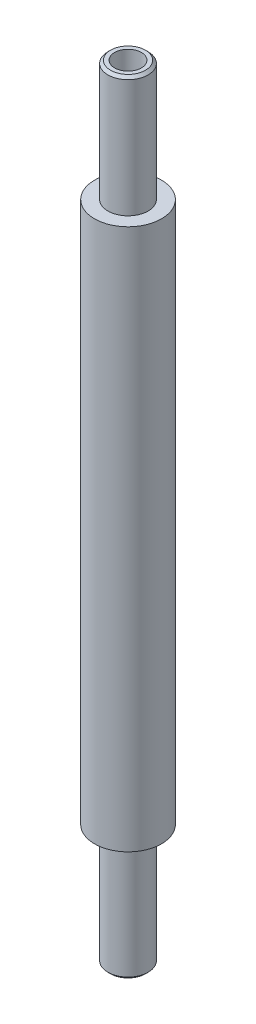
ISO-10303-21;
HEADER;
FILE_DESCRIPTION(('STEP AP214'),'2;1');
FILE_NAME('part.step','',(''),(''),'','','');
FILE_SCHEMA(('AUTOMOTIVE_DESIGN { 1 0 10303 214 1 1 1 1 }'));
ENDSEC;
DATA;
#1=APPLICATION_CONTEXT('core data for automotive mechanical design processes');
#2=APPLICATION_PROTOCOL_DEFINITION('international standard','automotive_design',2000,#1);
#3=PRODUCT_CONTEXT('',#1,'mechanical');
#4=PRODUCT('Part','Part','',(#3));
#5=PRODUCT_RELATED_PRODUCT_CATEGORY('part','',(#4));
#6=PRODUCT_DEFINITION_FORMATION('','',#4);
#7=PRODUCT_DEFINITION_CONTEXT('part definition',#1,'design');
#8=PRODUCT_DEFINITION('design','',#6,#7);
#9=PRODUCT_DEFINITION_SHAPE('','',#8);
#10=(LENGTH_UNIT() NAMED_UNIT(*) SI_UNIT(.MILLI.,.METRE.));
#11=(NAMED_UNIT(*) PLANE_ANGLE_UNIT() SI_UNIT($,.RADIAN.));
#12=(NAMED_UNIT(*) SI_UNIT($,.STERADIAN.) SOLID_ANGLE_UNIT());
#13=UNCERTAINTY_MEASURE_WITH_UNIT(LENGTH_MEASURE(1.E-05),#10,'distance_accuracy_value','');
#14=(GEOMETRIC_REPRESENTATION_CONTEXT(3) GLOBAL_UNCERTAINTY_ASSIGNED_CONTEXT((#13)) GLOBAL_UNIT_ASSIGNED_CONTEXT((#10,
#11,#12)) REPRESENTATION_CONTEXT('',''));
#15=CARTESIAN_POINT('',(0.,0.,0.));
#16=DIRECTION('',(0.,0.,1.));
#17=DIRECTION('',(1.,0.,0.));
#18=AXIS2_PLACEMENT_3D('',#15,#16,#17);
#19=CARTESIAN_POINT('',(0.,-18.97368787675,0.));
#20=DIRECTION('',(0.,-1.,0.));
#21=DIRECTION('',(0.,0.,-1.));
#22=AXIS2_PLACEMENT_3D('',#19,#20,#21);
#23=CYLINDRICAL_SURFACE('',#22,1.25);
#24=CARTESIAN_POINT('',(0.,-9.973687876752,0.));
#25=DIRECTION('',(0.,-1.,0.));
#26=DIRECTION('',(0.,0.,-1.));
#27=AXIS2_PLACEMENT_3D('',#24,#25,#26);
#28=CIRCLE('',#27,1.25);
#29=CARTESIAN_POINT('',(0.,-9.973687876752,-1.25));
#30=VERTEX_POINT('',#29);
#31=EDGE_CURVE('P0_E20',#30,#30,#28,.T.);
#32=ORIENTED_EDGE('',*,*,#31,.T.);
#33=EDGE_LOOP('',(#32));
#34=FACE_BOUND('',#33,.T.);
#35=CARTESIAN_POINT('',(0.,-18.97368787675,0.));
#36=DIRECTION('',(0.,-1.,0.));
#37=DIRECTION('',(0.,0.,-1.));
#38=AXIS2_PLACEMENT_3D('',#35,#36,#37);
#39=CIRCLE('',#38,1.25);
#40=CARTESIAN_POINT('',(0.,-18.97368787675,-1.25));
#41=VERTEX_POINT('',#40);
#42=EDGE_CURVE('P0_E11',#41,#41,#39,.F.);
#43=ORIENTED_EDGE('',*,*,#42,.T.);
#44=EDGE_LOOP('',(#43));
#45=FACE_BOUND('',#44,.T.);
#46=ADVANCED_FACE('P0_F16',(#34,#45),#23,.T.);
#47=CARTESIAN_POINT('',(0.,-9.973687876752,0.));
#48=DIRECTION('',(0.,-1.,0.));
#49=DIRECTION('',(0.,0.,-1.));
#50=AXIS2_PLACEMENT_3D('',#47,#48,#49);
#51=PLANE('',#50);
#52=ORIENTED_EDGE('',*,*,#31,.F.);
#53=EDGE_LOOP('',(#52));
#54=FACE_BOUND('',#53,.T.);
#55=CARTESIAN_POINT('',(-1.3,-9.973687876752,0.));
#56=CARTESIAN_POINT('',(-1.29833488802663,-9.973687876752,-0.262154555958757));
#57=CARTESIAN_POINT('',(-1.20112244684481,-9.973687876752,-0.497031911761741));
#58=CARTESIAN_POINT('',(-1.10206821395031,-9.973687876752,-0.736359265550115));
#59=CARTESIAN_POINT('',(-0.919215311209859,-9.973687876752,-0.919290796944211));
#60=CARTESIAN_POINT('',(-0.736728985367264,-9.973687876752,-1.10185559380857));
#61=CARTESIAN_POINT('',(-0.497487118350385,-9.973687876752,-1.20104393924733));
#62=CARTESIAN_POINT('',(-0.259127983854424,-9.973687876752,-1.29986630869993));
#63=CARTESIAN_POINT('',(0.,-9.973687876752,-1.29997271310605));
#64=CARTESIAN_POINT('',(0.258056095355892,-9.973687876752,-1.30007867736804));
#65=CARTESIAN_POINT('',(0.497487118350385,-9.973687876752,-1.20104393924733));
#66=CARTESIAN_POINT('',(0.73581861369254,-9.973687876752,-1.10246399362487));
#67=CARTESIAN_POINT('',(0.919215311209856,-9.973687876752,-0.919290796944215));
#68=CARTESIAN_POINT('',(1.10146428863283,-9.973687876752,-0.737263921660949));
#69=CARTESIAN_POINT('',(1.2011224468448,-9.973687876752,-0.497031911761753));
#70=CARTESIAN_POINT('',(1.29833139903807,-9.973687876752,-0.262703860907015));
#71=CARTESIAN_POINT('',(1.3,-9.973687876752,0.));
#72=B_SPLINE_CURVE_WITH_KNOTS('',2,(#55,#56,#57,#58,#59,#60,#61,#62,#63,#64,#65,#66,#67,#68,#69,
#70,#71),.UNSPECIFIED.,.F.,.F.,(3,2,2,2,2,2,2,2,3),(0.,0.125,0.25,0.375,0.5,0.625,0.75,0.875,
1.),.UNSPECIFIED.);
#73=CARTESIAN_POINT('',(-1.3,-9.973687876752,0.));
#74=VERTEX_POINT('',#73);
#75=CARTESIAN_POINT('',(1.3,-9.973687876752,0.));
#76=VERTEX_POINT('',#75);
#77=EDGE_CURVE('P0_E30',#74,#76,#72,.T.);
#78=ORIENTED_EDGE('',*,*,#77,.T.);
#79=CARTESIAN_POINT('',(1.3,-9.973687876752,0.));
#80=CARTESIAN_POINT('',(1.29833488802663,-9.973687876752,0.262154555958757));
#81=CARTESIAN_POINT('',(1.20112244684481,-9.973687876752,0.497031911761741));
#82=CARTESIAN_POINT('',(1.10206821395031,-9.973687876752,0.736359265550115));
#83=CARTESIAN_POINT('',(0.919215311209859,-9.973687876752,0.919290796944211));
#84=CARTESIAN_POINT('',(0.736728985367264,-9.973687876752,1.10185559380857));
#85=CARTESIAN_POINT('',(0.497487118350385,-9.973687876752,1.20104393924733));
#86=CARTESIAN_POINT('',(0.259127983854424,-9.973687876752,1.29986630869993));
#87=CARTESIAN_POINT('',(0.,-9.973687876752,1.29997271310605));
#88=CARTESIAN_POINT('',(-0.258056095355892,-9.973687876752,1.30007867736804));
#89=CARTESIAN_POINT('',(-0.497487118350385,-9.973687876752,1.20104393924733));
#90=CARTESIAN_POINT('',(-0.73581861369254,-9.973687876752,1.10246399362487));
#91=CARTESIAN_POINT('',(-0.919215311209856,-9.973687876752,0.919290796944215));
#92=CARTESIAN_POINT('',(-1.10146428863283,-9.973687876752,0.737263921660949));
#93=CARTESIAN_POINT('',(-1.2011224468448,-9.973687876752,0.497031911761753));
#94=CARTESIAN_POINT('',(-1.29833139903807,-9.973687876752,0.262703860907015));
#95=CARTESIAN_POINT('',(-1.3,-9.973687876752,0.));
#96=B_SPLINE_CURVE_WITH_KNOTS('',2,(#79,#80,#81,#82,#83,#84,#85,#86,#87,#88,#89,#90,#91,#92,#93,
#94,#95),.UNSPECIFIED.,.F.,.F.,(3,2,2,2,2,2,2,2,3),(0.,0.125,0.25,0.375,0.5,0.625,0.75,0.875,
1.),.UNSPECIFIED.);
#97=EDGE_CURVE('P0_E33',#76,#74,#96,.T.);
#98=ORIENTED_EDGE('',*,*,#97,.T.);
#99=EDGE_LOOP('',(#78,#98));
#100=FACE_BOUND('',#99,.T.);
#101=ADVANCED_FACE('P0_F17',(#54,#100),#51,.T.);
#102=OPEN_SHELL('',(#46,#101));
#103=SHELL_BASED_SURFACE_MODEL('P0_B1',(#102));
#104=CARTESIAN_POINT('',(0.,42.34631212325,0.));
#105=DIRECTION('',(0.,-1.,0.));
#106=DIRECTION('',(0.,0.,-1.));
#107=AXIS2_PLACEMENT_3D('',#104,#105,#106);
#108=CYLINDRICAL_SURFACE('',#107,1.);
#109=CARTESIAN_POINT('',(0.,-18.97368787675,0.));
#110=DIRECTION('',(0.,-1.,0.));
#111=DIRECTION('',(0.,0.,-1.));
#112=AXIS2_PLACEMENT_3D('',#109,#110,#111);
#113=CIRCLE('',#112,1.);
#114=CARTESIAN_POINT('',(0.,-18.97368787675,-1.));
#115=VERTEX_POINT('',#114);
#116=EDGE_CURVE('P1_E43',#115,#115,#113,.F.);
#117=ORIENTED_EDGE('',*,*,#116,.F.);
#118=EDGE_LOOP('',(#117));
#119=FACE_BOUND('',#118,.T.);
#120=CARTESIAN_POINT('',(0.,39.42631212325,0.));
#121=DIRECTION('',(0.,-1.,0.));
#122=DIRECTION('',(0.,0.,-1.));
#123=AXIS2_PLACEMENT_3D('',#120,#121,#122);
#124=CIRCLE('',#123,1.);
#125=CARTESIAN_POINT('',(0.,39.42631212325,-1.));
#126=VERTEX_POINT('',#125);
#127=EDGE_CURVE('P1_E17',#126,#126,#124,.F.);
#128=ORIENTED_EDGE('',*,*,#127,.T.);
#129=EDGE_LOOP('',(#128));
#130=FACE_BOUND('',#129,.T.);
#131=ADVANCED_FACE('P1_F14',(#119,#130),#108,.F.);
#132=CARTESIAN_POINT('',(0.,39.42631212325,0.));
#133=DIRECTION('',(0.,-1.,0.));
#134=DIRECTION('',(0.,0.,-1.));
#135=AXIS2_PLACEMENT_3D('',#132,#133,#134);
#136=PLANE('',#135);
#137=ORIENTED_EDGE('',*,*,#127,.F.);
#138=EDGE_LOOP('',(#137));
#139=FACE_BOUND('',#138,.T.);
#140=CARTESIAN_POINT('',(0.,39.4263121232257,0.));
#141=DIRECTION('',(0.,-1.,0.));
#142=DIRECTION('',(0.,0.,-1.));
#143=AXIS2_PLACEMENT_3D('',#140,#141,#142);
#144=CIRCLE('',#143,1.30000000001473);
#145=CARTESIAN_POINT('',(0.,39.4263121232257,-1.30000000001473));
#146=VERTEX_POINT('',#145);
#147=EDGE_CURVE('P1_E41',#146,#146,#144,.T.);
#148=ORIENTED_EDGE('',*,*,#147,.F.);
#149=EDGE_LOOP('',(#148));
#150=FACE_BOUND('',#149,.T.);
#151=ADVANCED_FACE('P1_F51',(#139,#150),#136,.F.);
#152=CARTESIAN_POINT('',(0.,-18.97368787675,0.));
#153=DIRECTION('',(0.,-1.,0.));
#154=DIRECTION('',(0.,0.,-1.));
#155=AXIS2_PLACEMENT_3D('',#152,#153,#154);
#156=PLANE('',#155);
#157=ORIENTED_EDGE('',*,*,#116,.T.);
#158=EDGE_LOOP('',(#157));
#159=FACE_BOUND('',#158,.T.);
#160=CARTESIAN_POINT('',(0.,-18.9736878767803,0.));
#161=DIRECTION('',(0.,1.,0.));
#162=DIRECTION('',(0.,0.,1.));
#163=AXIS2_PLACEMENT_3D('',#160,#161,#162);
#164=CIRCLE('',#163,1.29999999995789);
#165=CARTESIAN_POINT('',(0.,-18.9736878767803,1.29999999995789));
#166=VERTEX_POINT('',#165);
#167=EDGE_CURVE('P1_E38',#166,#166,#164,.T.);
#168=ORIENTED_EDGE('',*,*,#167,.F.);
#169=EDGE_LOOP('',(#168));
#170=FACE_BOUND('',#169,.T.);
#171=ADVANCED_FACE('P1_F54',(#159,#170),#156,.T.);
#172=CARTESIAN_POINT('',(0.,39.2263121232759,0.));
#173=DIRECTION('',(0.,-1.,0.));
#174=DIRECTION('',(0.,0.,-1.));
#175=AXIS2_PLACEMENT_3D('',#172,#173,#174);
#176=CONICAL_SURFACE('',#175,1.49999999996453,0.785398163397448);
#177=ORIENTED_EDGE('',*,*,#147,.T.);
#178=EDGE_LOOP('',(#177));
#179=FACE_BOUND('',#178,.T.);
#180=CARTESIAN_POINT('',(0.,39.22631212325,0.));
#181=DIRECTION('',(0.,-1.,0.));
#182=DIRECTION('',(0.,0.,-1.));
#183=AXIS2_PLACEMENT_3D('',#180,#181,#182);
#184=CIRCLE('',#183,1.5);
#185=CARTESIAN_POINT('',(0.,39.22631212325,-1.5));
#186=VERTEX_POINT('',#185);
#187=EDGE_CURVE('P1_E29',#186,#186,#184,.T.);
#188=ORIENTED_EDGE('',*,*,#187,.F.);
#189=EDGE_LOOP('',(#188));
#190=FACE_BOUND('',#189,.T.);
#191=ADVANCED_FACE('P1_F57',(#179,#190),#176,.T.);
#192=CARTESIAN_POINT('',(0.,-18.7736878767737,0.));
#193=DIRECTION('',(0.,1.,0.));
#194=DIRECTION('',(0.,0.,1.));
#195=AXIS2_PLACEMENT_3D('',#192,#193,#194);
#196=CONICAL_SURFACE('',#195,1.50000000002137,0.785398163539557);
#197=CARTESIAN_POINT('',(0.,-18.77368787675,0.));
#198=DIRECTION('',(0.,-1.,0.));
#199=DIRECTION('',(0.,0.,-1.));
#200=AXIS2_PLACEMENT_3D('',#197,#198,#199);
#201=CIRCLE('',#200,1.5);
#202=CARTESIAN_POINT('',(0.,-18.77368787675,-1.5));
#203=VERTEX_POINT('',#202);
#204=EDGE_CURVE('P1_E37',#203,#203,#201,.F.);
#205=ORIENTED_EDGE('',*,*,#204,.F.);
#206=EDGE_LOOP('',(#205));
#207=FACE_BOUND('',#206,.T.);
#208=ORIENTED_EDGE('',*,*,#167,.T.);
#209=EDGE_LOOP('',(#208));
#210=FACE_BOUND('',#209,.T.);
#211=ADVANCED_FACE('P1_F60',(#207,#210),#196,.T.);
#212=CARTESIAN_POINT('',(0.,42.34631212325,0.));
#213=DIRECTION('',(0.,-1.,0.));
#214=DIRECTION('',(0.,0.,-1.));
#215=AXIS2_PLACEMENT_3D('',#212,#213,#214);
#216=CYLINDRICAL_SURFACE('',#215,1.5);
#217=CARTESIAN_POINT('',(0.,30.42631212325,0.));
#218=DIRECTION('',(0.,-1.,0.));
#219=DIRECTION('',(0.,0.,-1.));
#220=AXIS2_PLACEMENT_3D('',#217,#218,#219);
#221=CIRCLE('',#220,1.5);
#222=CARTESIAN_POINT('',(0.,30.42631212325,-1.5));
#223=VERTEX_POINT('',#222);
#224=EDGE_CURVE('P1_E34',#223,#223,#221,.F.);
#225=ORIENTED_EDGE('',*,*,#224,.T.);
#226=EDGE_LOOP('',(#225));
#227=FACE_BOUND('',#226,.T.);
#228=ORIENTED_EDGE('',*,*,#187,.T.);
#229=EDGE_LOOP('',(#228));
#230=FACE_BOUND('',#229,.T.);
#231=ADVANCED_FACE('P1_F72',(#227,#230),#216,.T.);
#232=CARTESIAN_POINT('',(0.,42.34631212325,0.));
#233=DIRECTION('',(0.,-1.,0.));
#234=DIRECTION('',(0.,0.,-1.));
#235=AXIS2_PLACEMENT_3D('',#232,#233,#234);
#236=CYLINDRICAL_SURFACE('',#235,1.5);
#237=CARTESIAN_POINT('',(0.,-9.973687876752,0.));
#238=DIRECTION('',(0.,-1.,0.));
#239=DIRECTION('',(0.,0.,-1.));
#240=AXIS2_PLACEMENT_3D('',#237,#238,#239);
#241=CIRCLE('',#240,1.5);
#242=CARTESIAN_POINT('',(0.,-9.973687876752,-1.5));
#243=VERTEX_POINT('',#242);
#244=EDGE_CURVE('P1_E26',#243,#243,#241,.F.);
#245=ORIENTED_EDGE('',*,*,#244,.F.);
#246=EDGE_LOOP('',(#245));
#247=FACE_BOUND('',#246,.T.);
#248=ORIENTED_EDGE('',*,*,#204,.T.);
#249=EDGE_LOOP('',(#248));
#250=FACE_BOUND('',#249,.T.);
#251=ADVANCED_FACE('P1_F68',(#247,#250),#236,.T.);
#252=CARTESIAN_POINT('',(0.,30.42631212325,0.));
#253=DIRECTION('',(0.,-1.,0.));
#254=DIRECTION('',(0.,0.,-1.));
#255=AXIS2_PLACEMENT_3D('',#252,#253,#254);
#256=PLANE('',#255);
#257=ORIENTED_EDGE('',*,*,#224,.F.);
#258=EDGE_LOOP('',(#257));
#259=FACE_BOUND('',#258,.T.);
#260=CARTESIAN_POINT('',(0.,30.42631212325,0.));
#261=DIRECTION('',(0.,-1.,0.));
#262=DIRECTION('',(0.,0.,-1.));
#263=AXIS2_PLACEMENT_3D('',#260,#261,#262);
#264=CIRCLE('',#263,2.5);
#265=CARTESIAN_POINT('',(0.,30.42631212325,-2.5));
#266=VERTEX_POINT('',#265);
#267=EDGE_CURVE('P1_E21',#266,#266,#264,.T.);
#268=ORIENTED_EDGE('',*,*,#267,.F.);
#269=EDGE_LOOP('',(#268));
#270=FACE_BOUND('',#269,.T.);
#271=ADVANCED_FACE('P1_F88',(#259,#270),#256,.F.);
#272=CARTESIAN_POINT('',(0.,-9.973687876752,0.));
#273=DIRECTION('',(0.,-1.,0.));
#274=DIRECTION('',(0.,0.,-1.));
#275=AXIS2_PLACEMENT_3D('',#272,#273,#274);
#276=PLANE('',#275);
#277=ORIENTED_EDGE('',*,*,#244,.T.);
#278=EDGE_LOOP('',(#277));
#279=FACE_BOUND('',#278,.T.);
#280=CARTESIAN_POINT('',(0.,-9.973687876752,0.));
#281=DIRECTION('',(0.,-1.,0.));
#282=DIRECTION('',(0.,0.,-1.));
#283=AXIS2_PLACEMENT_3D('',#280,#281,#282);
#284=CIRCLE('',#283,2.5);
#285=CARTESIAN_POINT('',(0.,-9.973687876752,-2.5));
#286=VERTEX_POINT('',#285);
#287=EDGE_CURVE('P1_E10',#286,#286,#284,.F.);
#288=ORIENTED_EDGE('',*,*,#287,.F.);
#289=EDGE_LOOP('',(#288));
#290=FACE_BOUND('',#289,.T.);
#291=ADVANCED_FACE('P1_F83',(#279,#290),#276,.T.);
#292=CARTESIAN_POINT('',(0.,42.34631212325,0.));
#293=DIRECTION('',(0.,-1.,0.));
#294=DIRECTION('',(0.,0.,-1.));
#295=AXIS2_PLACEMENT_3D('',#292,#293,#294);
#296=CYLINDRICAL_SURFACE('',#295,2.5);
#297=ORIENTED_EDGE('',*,*,#287,.T.);
#298=EDGE_LOOP('',(#297));
#299=FACE_BOUND('',#298,.T.);
#300=ORIENTED_EDGE('',*,*,#267,.T.);
#301=EDGE_LOOP('',(#300));
#302=FACE_BOUND('',#301,.T.);
#303=ADVANCED_FACE('P1_F81',(#299,#302),#296,.T.);
#304=CLOSED_SHELL('',(#131,#151,#171,#191,#211,#231,#251,#271,#291,#303));
#305=MANIFOLD_SOLID_BREP('P1_B1',#304);
#306=CARTESIAN_POINT('',(0.,39.42631212325,0.));
#307=DIRECTION('',(0.,1.,0.));
#308=DIRECTION('',(0.,0.,1.));
#309=AXIS2_PLACEMENT_3D('',#306,#307,#308);
#310=CYLINDRICAL_SURFACE('',#309,1.25);
#311=CARTESIAN_POINT('',(0.,30.42631212325,0.));
#312=DIRECTION('',(0.,1.,0.));
#313=DIRECTION('',(0.,0.,1.));
#314=AXIS2_PLACEMENT_3D('',#311,#312,#313);
#315=CIRCLE('',#314,1.25);
#316=CARTESIAN_POINT('',(0.,30.42631212325,1.25));
#317=VERTEX_POINT('',#316);
#318=EDGE_CURVE('P2_E20',#317,#317,#315,.T.);
#319=ORIENTED_EDGE('',*,*,#318,.T.);
#320=EDGE_LOOP('',(#319));
#321=FACE_BOUND('',#320,.T.);
#322=CARTESIAN_POINT('',(0.,39.42631212325,0.));
#323=DIRECTION('',(0.,1.,0.));
#324=DIRECTION('',(0.,0.,1.));
#325=AXIS2_PLACEMENT_3D('',#322,#323,#324);
#326=CIRCLE('',#325,1.25);
#327=CARTESIAN_POINT('',(0.,39.42631212325,1.25));
#328=VERTEX_POINT('',#327);
#329=EDGE_CURVE('P2_E11',#328,#328,#326,.F.);
#330=ORIENTED_EDGE('',*,*,#329,.T.);
#331=EDGE_LOOP('',(#330));
#332=FACE_BOUND('',#331,.T.);
#333=ADVANCED_FACE('P2_F16',(#321,#332),#310,.T.);
#334=CARTESIAN_POINT('',(0.,30.42631212325,0.));
#335=DIRECTION('',(0.,1.,0.));
#336=DIRECTION('',(0.,0.,1.));
#337=AXIS2_PLACEMENT_3D('',#334,#335,#336);
#338=PLANE('',#337);
#339=ORIENTED_EDGE('',*,*,#318,.F.);
#340=EDGE_LOOP('',(#339));
#341=FACE_BOUND('',#340,.T.);
#342=CARTESIAN_POINT('',(1.5,30.42631212325,0.));
#343=CARTESIAN_POINT('',(1.49979748347061,30.42631212325,-0.286359644118344));
#344=CARTESIAN_POINT('',(1.39468245159365,30.42631212325,-0.552142064342809));
#345=CARTESIAN_POINT('',(1.28062366104051,30.42631212325,-0.840538698580363));
#346=CARTESIAN_POINT('',(1.06066017177982,30.42631212325,-1.06066017177982));
#347=CARTESIAN_POINT('',(0.841441605257487,30.42631212325,-1.28003618721656));
#348=CARTESIAN_POINT('',(0.552142064342809,30.42631212325,-1.39468245159365));
#349=CARTESIAN_POINT('',(0.286638464368925,30.42631212325,-1.49989864315564));
#350=CARTESIAN_POINT('',(0.,30.42631212325,-1.5));
#351=CARTESIAN_POINT('',(-0.285592238421652,30.42631212325,-1.50010098689345));
#352=CARTESIAN_POINT('',(-0.552142064342809,30.42631212325,-1.39468245159365));
#353=CARTESIAN_POINT('',(-0.840538698580466,30.42631212325,-1.28062366104046));
#354=CARTESIAN_POINT('',(-1.06066017177982,30.42631212325,-1.06066017177982));
#355=CARTESIAN_POINT('',(-1.28003618721632,30.42631212325,-0.841441605257661));
#356=CARTESIAN_POINT('',(-1.39468245159365,30.42631212325,-0.552142064342809));
#357=CARTESIAN_POINT('',(-1.499797105083,30.42631212325,-0.28689468656685));
#358=CARTESIAN_POINT('',(-1.5,30.42631212325,0.));
#359=B_SPLINE_CURVE_WITH_KNOTS('',2,(#342,#343,#344,#345,#346,#347,#348,#349,#350,#351,#352,
#353,#354,#355,#356,#357,#358),.UNSPECIFIED.,.F.,.F.,(3,2,2,2,2,2,2,2,3),(0.,0.125,0.25,0.375,
0.5,0.625,0.75,0.875,1.),.UNSPECIFIED.);
#360=CARTESIAN_POINT('',(1.5,30.42631212325,0.));
#361=VERTEX_POINT('',#360);
#362=CARTESIAN_POINT('',(-1.5,30.42631212325,0.));
#363=VERTEX_POINT('',#362);
#364=EDGE_CURVE('P2_E30',#361,#363,#359,.T.);
#365=ORIENTED_EDGE('',*,*,#364,.T.);
#366=CARTESIAN_POINT('',(-1.5,30.42631212325,0.));
#367=CARTESIAN_POINT('',(-1.49979748347061,30.42631212325,0.286359644118344));
#368=CARTESIAN_POINT('',(-1.39468245159365,30.42631212325,0.552142064342809));
#369=CARTESIAN_POINT('',(-1.28062366104051,30.42631212325,0.840538698580363));
#370=CARTESIAN_POINT('',(-1.06066017177982,30.42631212325,1.06066017177982));
#371=CARTESIAN_POINT('',(-0.841441605257487,30.42631212325,1.28003618721656));
#372=CARTESIAN_POINT('',(-0.552142064342809,30.42631212325,1.39468245159365));
#373=CARTESIAN_POINT('',(-0.286638464368925,30.42631212325,1.49989864315564));
#374=CARTESIAN_POINT('',(0.,30.42631212325,1.5));
#375=CARTESIAN_POINT('',(0.285592238421652,30.42631212325,1.50010098689345));
#376=CARTESIAN_POINT('',(0.552142064342809,30.42631212325,1.39468245159365));
#377=CARTESIAN_POINT('',(0.840538698580466,30.42631212325,1.28062366104046));
#378=CARTESIAN_POINT('',(1.06066017177982,30.42631212325,1.06066017177982));
#379=CARTESIAN_POINT('',(1.28003618721632,30.42631212325,0.841441605257661));
#380=CARTESIAN_POINT('',(1.39468245159365,30.42631212325,0.552142064342809));
#381=CARTESIAN_POINT('',(1.499797105083,30.42631212325,0.28689468656685));
#382=CARTESIAN_POINT('',(1.5,30.42631212325,0.));
#383=B_SPLINE_CURVE_WITH_KNOTS('',2,(#366,#367,#368,#369,#370,#371,#372,#373,#374,#375,#376,
#377,#378,#379,#380,#381,#382),.UNSPECIFIED.,.F.,.F.,(3,2,2,2,2,2,2,2,3),(0.,0.125,0.25,0.375,
0.5,0.625,0.75,0.875,1.),.UNSPECIFIED.);
#384=EDGE_CURVE('P2_E33',#363,#361,#383,.T.);
#385=ORIENTED_EDGE('',*,*,#384,.T.);
#386=EDGE_LOOP('',(#365,#385));
#387=FACE_BOUND('',#386,.T.);
#388=ADVANCED_FACE('P2_F17',(#341,#387),#338,.T.);
#389=OPEN_SHELL('',(#333,#388));
#390=SHELL_BASED_SURFACE_MODEL('P2_B1',(#389));
#391=ADVANCED_BREP_SHAPE_REPRESENTATION('',(#18,#305),#14);
#392=MANIFOLD_SURFACE_SHAPE_REPRESENTATION('',(#18,#103,#390),#14);
#393=SHAPE_REPRESENTATION('',(#18),#14);
#394=SHAPE_DEFINITION_REPRESENTATION(#9,#393);
#395=SHAPE_REPRESENTATION_RELATIONSHIP('','',#393,#391);
#396=SHAPE_REPRESENTATION_RELATIONSHIP('','',#393,#392);
ENDSEC;
END-ISO-10303-21;
